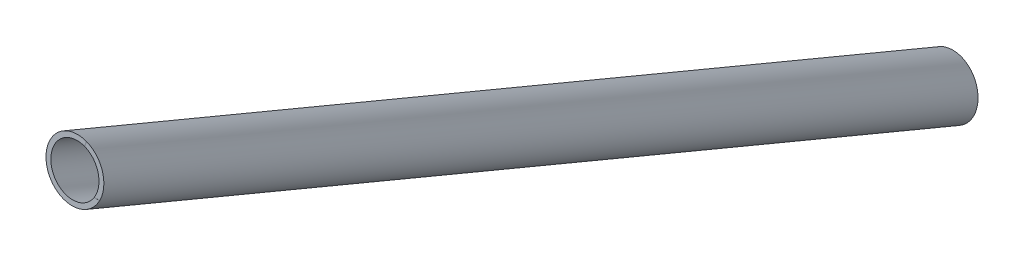
ISO-10303-21;
HEADER;
FILE_DESCRIPTION(('STEP AP214'),'2;1');
FILE_NAME('part.step','',(''),(''),'','','');
FILE_SCHEMA(('AUTOMOTIVE_DESIGN { 1 0 10303 214 1 1 1 1 }'));
ENDSEC;
DATA;
#1=APPLICATION_CONTEXT('core data for automotive mechanical design processes');
#2=APPLICATION_PROTOCOL_DEFINITION('international standard','automotive_design',2000,#1);
#3=PRODUCT_CONTEXT('',#1,'mechanical');
#4=PRODUCT('Part','Part','',(#3));
#5=PRODUCT_RELATED_PRODUCT_CATEGORY('part','',(#4));
#6=PRODUCT_DEFINITION_FORMATION('','',#4);
#7=PRODUCT_DEFINITION_CONTEXT('part definition',#1,'design');
#8=PRODUCT_DEFINITION('design','',#6,#7);
#9=PRODUCT_DEFINITION_SHAPE('','',#8);
#10=(LENGTH_UNIT() NAMED_UNIT(*) SI_UNIT(.MILLI.,.METRE.));
#11=(NAMED_UNIT(*) PLANE_ANGLE_UNIT() SI_UNIT($,.RADIAN.));
#12=(NAMED_UNIT(*) SI_UNIT($,.STERADIAN.) SOLID_ANGLE_UNIT());
#13=UNCERTAINTY_MEASURE_WITH_UNIT(LENGTH_MEASURE(1.E-05),#10,'distance_accuracy_value','');
#14=(GEOMETRIC_REPRESENTATION_CONTEXT(3) GLOBAL_UNCERTAINTY_ASSIGNED_CONTEXT((#13)) GLOBAL_UNIT_ASSIGNED_CONTEXT((#10,
#11,#12)) REPRESENTATION_CONTEXT('',''));
#15=CARTESIAN_POINT('',(0.,0.,0.));
#16=DIRECTION('',(0.,0.,1.));
#17=DIRECTION('',(1.,0.,0.));
#18=AXIS2_PLACEMENT_3D('',#15,#16,#17);
#19=CARTESIAN_POINT('',(234.435561180805,196.461664557198,-459.922215856224));
#20=DIRECTION('',(-0.00725504842418489,0.00272064315906934,0.999969980736004));
#21=DIRECTION('',(0.999973681595049,0.,0.00725507527490251));
#22=AXIS2_PLACEMENT_3D('',#19,#20,#21);
#23=PLANE('',#22);
#24=CARTESIAN_POINT('',(222.99993995967,194.66650655912,-460.000300201652));
#25=DIRECTION('',(-0.00725504842418489,0.00272064315906934,0.999969980736004));
#26=DIRECTION('',(-0.363826486058294,-0.931466734207249,-0.000105393339862839));
#27=AXIS2_PLACEMENT_3D('',#24,#25,#26);
#28=ELLIPSE('',#27,9.09194922448359,7.90000000000002);
#29=CARTESIAN_POINT('',(226.228538067358,203.165762662061,-460.));
#30=VERTEX_POINT('',#29);
#31=CARTESIAN_POINT('',(229.470513855198,190.031603110124,-459.940744168518));
#32=VERTEX_POINT('',#31);
#33=EDGE_CURVE('E62',#30,#32,#28,.T.);
#34=ORIENTED_EDGE('',*,*,#33,.F.);
#35=DIRECTION('',(-0.351123441588392,-0.936329177569044,0.));
#36=VECTOR('',#35,1.);
#37=CARTESIAN_POINT('',(221.748604553722,191.219273292354,-460.));
#38=LINE('',#37,#36);
#39=CARTESIAN_POINT('',(226.87508644047,204.889891657027,-460.));
#40=VERTEX_POINT('',#39);
#41=EDGE_CURVE('E82',#40,#30,#38,.T.);
#42=ORIENTED_EDGE('',*,*,#41,.F.);
#43=CARTESIAN_POINT('',(222.99993995967,194.66650655912,-460.000300201652));
#44=DIRECTION('',(-0.00725504842418489,0.00272064315906934,0.999969980736004));
#45=DIRECTION('',(-0.363826486058294,-0.931466734207249,-0.000105393339862839));
#46=AXIS2_PLACEMENT_3D('',#43,#44,#45);
#47=ELLIPSE('',#46,10.9333566623536,9.49999999999999);
#48=CARTESIAN_POINT('',(231.320522024502,190.038751298671,-459.927341314991));
#49=VERTEX_POINT('',#48);
#50=EDGE_CURVE('E48',#40,#49,#47,.T.);
#51=ORIENTED_EDGE('',*,*,#50,.T.);
#52=DIRECTION('',(-0.999966293735738,-0.0038637384026641,-0.00724450950499518));
#53=VECTOR('',#52,1.);
#54=CARTESIAN_POINT('',(628.852679318905,191.574763334331,-457.047318748129));
#55=LINE('',#54,#53);
#56=EDGE_CURVE('E11',#49,#32,#55,.T.);
#57=ORIENTED_EDGE('',*,*,#56,.T.);
#58=EDGE_LOOP('',(#34,#42,#51,#57));
#59=FACE_BOUND('',#58,.T.);
#60=ADVANCED_FACE('F39',(#59),#23,.T.);
#61=CARTESIAN_POINT('',(610.924103299274,1219.13094213139,1469.62051649636));
#62=DIRECTION('',(0.,-0.882352941176471,0.470588235294118));
#63=DIRECTION('',(0.,-0.470588235294118,-0.882352941176471));
#64=AXIS2_PLACEMENT_3D('',#61,#62,#63);
#65=PLANE('',#64);
#66=ORIENTED_EDGE('',*,*,#56,.F.);
#67=DIRECTION('',(-0.173785333909048,-0.463427557090794,-0.868926669545238));
#68=VECTOR('',#67,1.);
#69=CARTESIAN_POINT('',(617.230093586775,1219.13094213139,1469.62051649636));
#70=LINE('',#69,#68);
#71=CARTESIAN_POINT('',(231.3059902875,190.,-460.));
#72=VERTEX_POINT('',#71);
#73=EDGE_CURVE('E80',#49,#72,#70,.T.);
#74=ORIENTED_EDGE('',*,*,#73,.T.);
#75=DIRECTION('',(-1.,0.,0.));
#76=VECTOR('',#75,1.);
#77=CARTESIAN_POINT('',(225.,190.,-460.));
#78=LINE('',#77,#76);
#79=CARTESIAN_POINT('',(229.458662688902,190.,-460.));
#80=VERTEX_POINT('',#79);
#81=EDGE_CURVE('E86',#72,#80,#78,.T.);
#82=ORIENTED_EDGE('',*,*,#81,.T.);
#83=DIRECTION('',(-0.173785333909048,-0.463427557090794,-0.868926669545238));
#84=VECTOR('',#83,1.);
#85=CARTESIAN_POINT('',(615.382765988176,1219.13094213139,1469.62051649636));
#86=LINE('',#85,#84);
#87=EDGE_CURVE('E43',#32,#80,#86,.T.);
#88=ORIENTED_EDGE('',*,*,#87,.F.);
#89=EDGE_LOOP('',(#66,#74,#82,#88));
#90=FACE_BOUND('',#89,.T.);
#91=ADVANCED_FACE('F92',(#90),#65,.F.);
#92=CARTESIAN_POINT('',(225.,200.,-450.000000000001));
#93=DIRECTION('',(-0.173785333909048,-0.463427557090794,-0.868926669545238));
#94=DIRECTION('',(0.,0.882352941176471,-0.470588235294118));
#95=AXIS2_PLACEMENT_3D('',#92,#93,#94);
#96=CYLINDRICAL_SURFACE('',#95,9.49999999999999);
#97=ORIENTED_EDGE('',*,*,#50,.F.);
#98=CARTESIAN_POINT('',(223.,194.666666666667,-460.));
#99=DIRECTION('',(0.,0.,1.));
#100=DIRECTION('',(-0.351123441588393,-0.936329177569044,0.));
#101=AXIS2_PLACEMENT_3D('',#98,#99,#100);
#102=ELLIPSE('',#101,10.9330284510336,9.49999999999999);
#103=EDGE_CURVE('E76',#72,#40,#102,.T.);
#104=ORIENTED_EDGE('',*,*,#103,.F.);
#105=ORIENTED_EDGE('',*,*,#73,.F.);
#106=EDGE_LOOP('',(#97,#104,#105));
#107=FACE_BOUND('',#106,.T.);
#108=CARTESIAN_POINT('',(150.,4.9960036108132E-13,-825.));
#109=DIRECTION('',(0.0197141066523152,-0.0461644942318042,-0.998739302055958));
#110=DIRECTION('',(-0.412111349099456,-0.910500714966001,0.0339512001235188));
#111=AXIS2_PLACEMENT_3D('',#108,#109,#110);
#112=ELLIPSE('',#111,10.7247795684855,9.49999999999999);
#113=CARTESIAN_POINT('',(145.580196623237,-9.76491946495829,-824.63588086259));
#114=VERTEX_POINT('',#113);
#115=EDGE_CURVE('E95',#114,#114,#112,.T.);
#116=ORIENTED_EDGE('',*,*,#115,.F.);
#117=EDGE_LOOP('',(#116));
#118=FACE_BOUND('',#117,.T.);
#119=ADVANCED_FACE('F77',(#107,#118),#96,.T.);
#120=CARTESIAN_POINT('',(225.,200.,-450.000000000001));
#121=DIRECTION('',(-0.173785333909048,-0.463427557090794,-0.868926669545238));
#122=DIRECTION('',(0.,0.882352941176471,-0.470588235294118));
#123=AXIS2_PLACEMENT_3D('',#120,#121,#122);
#124=CYLINDRICAL_SURFACE('',#123,7.90000000000002);
#125=ORIENTED_EDGE('',*,*,#87,.T.);
#126=CARTESIAN_POINT('',(223.,194.666666666667,-460.));
#127=DIRECTION('',(0.,0.,1.));
#128=DIRECTION('',(-0.351123441588393,-0.936329177569044,0.));
#129=AXIS2_PLACEMENT_3D('',#126,#127,#128);
#130=ELLIPSE('',#129,9.09167629085958,7.90000000000002);
#131=EDGE_CURVE('E56',#80,#30,#130,.T.);
#132=ORIENTED_EDGE('',*,*,#131,.T.);
#133=ORIENTED_EDGE('',*,*,#33,.T.);
#134=EDGE_LOOP('',(#125,#132,#133));
#135=FACE_BOUND('',#134,.T.);
#136=CARTESIAN_POINT('',(150.,4.9960036108132E-13,-825.));
#137=DIRECTION('',(0.0197141066523152,-0.0461644942318042,-0.998739302055958));
#138=DIRECTION('',(-0.412111349099456,-0.910500714966001,0.0339512001235188));
#139=AXIS2_PLACEMENT_3D('',#136,#137,#138);
#140=ELLIPSE('',#139,8.91850090431953,7.90000000000002);
#141=CARTESIAN_POINT('',(146.324584560376,-8.12030144980736,-824.697206190996));
#142=VERTEX_POINT('',#141);
#143=EDGE_CURVE('E83',#142,#142,#140,.T.);
#144=ORIENTED_EDGE('',*,*,#143,.T.);
#145=EDGE_LOOP('',(#144));
#146=FACE_BOUND('',#145,.T.);
#147=ADVANCED_FACE('F41',(#135,#146),#124,.F.);
#148=CARTESIAN_POINT('',(225.,190.,-460.));
#149=DIRECTION('',(0.,0.,1.));
#150=DIRECTION('',(1.,0.,0.));
#151=AXIS2_PLACEMENT_3D('',#148,#149,#150);
#152=PLANE('',#151);
#153=ORIENTED_EDGE('',*,*,#103,.T.);
#154=ORIENTED_EDGE('',*,*,#41,.T.);
#155=ORIENTED_EDGE('',*,*,#131,.F.);
#156=ORIENTED_EDGE('',*,*,#81,.F.);
#157=EDGE_LOOP('',(#153,#154,#155,#156));
#158=FACE_BOUND('',#157,.T.);
#159=ADVANCED_FACE('F87',(#158),#152,.T.);
#160=CARTESIAN_POINT('',(150.,0.,-825.));
#161=DIRECTION('',(0.0197141066523152,-0.0461644942318042,-0.998739302055958));
#162=DIRECTION('',(0.,0.998933436662963,-0.0461734676705452));
#163=AXIS2_PLACEMENT_3D('',#160,#161,#162);
#164=PLANE('',#163);
#165=ORIENTED_EDGE('',*,*,#143,.F.);
#166=EDGE_LOOP('',(#165));
#167=FACE_BOUND('',#166,.T.);
#168=ORIENTED_EDGE('',*,*,#115,.T.);
#169=EDGE_LOOP('',(#168));
#170=FACE_BOUND('',#169,.T.);
#171=ADVANCED_FACE('F104',(#167,#170),#164,.T.);
#172=CLOSED_SHELL('',(#60,#91,#119,#147,#159,#171));
#173=MANIFOLD_SOLID_BREP('B2',#172);
#174=ADVANCED_BREP_SHAPE_REPRESENTATION('',(#18,#173),#14);
#175=SHAPE_DEFINITION_REPRESENTATION(#9,#174);
ENDSEC;
END-ISO-10303-21;
